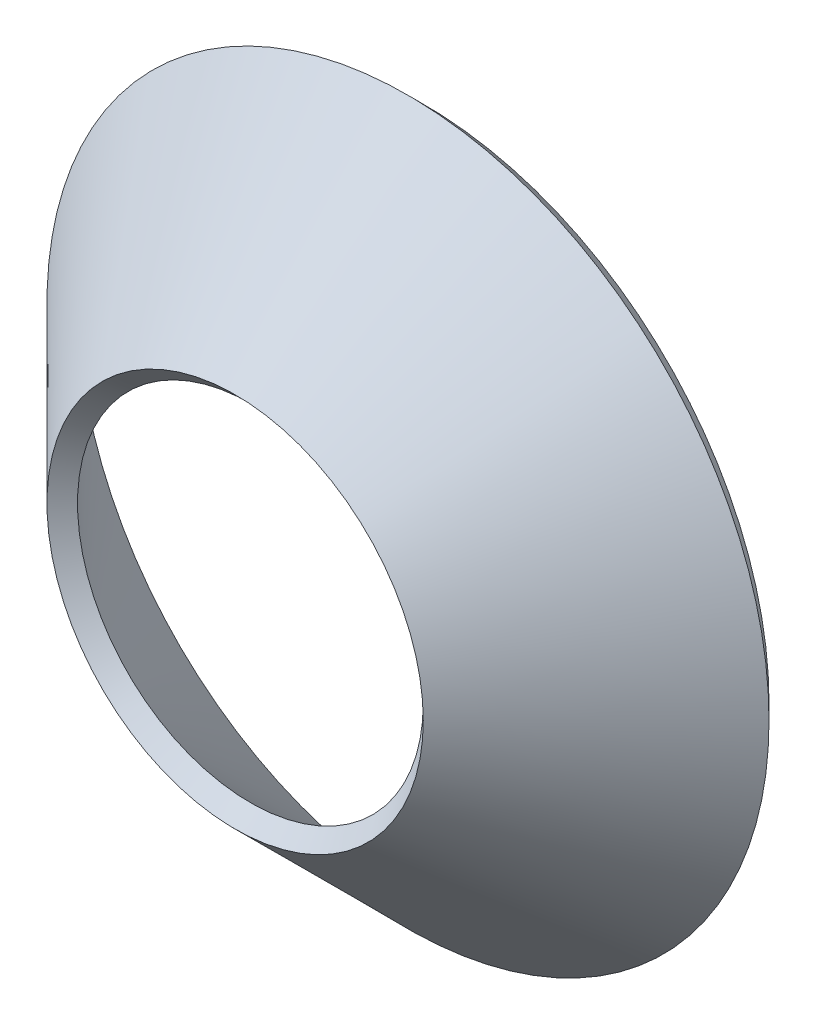
ISO-10303-21;
HEADER;
FILE_DESCRIPTION(('STEP AP214'),'2;1');
FILE_NAME('part.step','',(''),(''),'','','');
FILE_SCHEMA(('AUTOMOTIVE_DESIGN { 1 0 10303 214 1 1 1 1 }'));
ENDSEC;
DATA;
#1=APPLICATION_CONTEXT('core data for automotive mechanical design processes');
#2=APPLICATION_PROTOCOL_DEFINITION('international standard','automotive_design',2000,#1);
#3=PRODUCT_CONTEXT('',#1,'mechanical');
#4=PRODUCT('Part','Part','',(#3));
#5=PRODUCT_RELATED_PRODUCT_CATEGORY('part','',(#4));
#6=PRODUCT_DEFINITION_FORMATION('','',#4);
#7=PRODUCT_DEFINITION_CONTEXT('part definition',#1,'design');
#8=PRODUCT_DEFINITION('design','',#6,#7);
#9=PRODUCT_DEFINITION_SHAPE('','',#8);
#10=(LENGTH_UNIT() NAMED_UNIT(*) SI_UNIT(.MILLI.,.METRE.));
#11=(NAMED_UNIT(*) PLANE_ANGLE_UNIT() SI_UNIT($,.RADIAN.));
#12=(NAMED_UNIT(*) SI_UNIT($,.STERADIAN.) SOLID_ANGLE_UNIT());
#13=UNCERTAINTY_MEASURE_WITH_UNIT(LENGTH_MEASURE(1.E-05),#10,'distance_accuracy_value','');
#14=(GEOMETRIC_REPRESENTATION_CONTEXT(3) GLOBAL_UNCERTAINTY_ASSIGNED_CONTEXT((#13)) GLOBAL_UNIT_ASSIGNED_CONTEXT((#10,
#11,#12)) REPRESENTATION_CONTEXT('',''));
#15=CARTESIAN_POINT('',(0.,0.,0.));
#16=DIRECTION('',(0.,0.,1.));
#17=DIRECTION('',(1.,0.,0.));
#18=AXIS2_PLACEMENT_3D('',#15,#16,#17);
#19=CARTESIAN_POINT('',(0.,0.,25.4));
#20=DIRECTION('',(0.,0.,-1.));
#21=DIRECTION('',(-1.,0.,0.));
#22=AXIS2_PLACEMENT_3D('',#19,#20,#21);
#23=CONICAL_SURFACE('',#22,25.4,0.785398163397454);
#24=CARTESIAN_POINT('',(0.,0.,0.));
#25=DIRECTION('',(0.,0.,1.));
#26=DIRECTION('',(1.,0.,0.));
#27=AXIS2_PLACEMENT_3D('',#24,#25,#26);
#28=CIRCLE('',#27,50.8000000000003);
#29=CARTESIAN_POINT('',(50.8000000000003,0.,0.));
#30=VERTEX_POINT('',#29);
#31=EDGE_CURVE('E60',#30,#30,#28,.T.);
#32=ORIENTED_EDGE('',*,*,#31,.F.);
#33=EDGE_LOOP('',(#32));
#34=FACE_BOUND('',#33,.T.);
#35=CARTESIAN_POINT('',(0.,0.,25.4));
#36=DIRECTION('',(0.,0.,1.));
#37=DIRECTION('',(1.,0.,0.));
#38=AXIS2_PLACEMENT_3D('',#35,#36,#37);
#39=CIRCLE('',#38,25.4);
#40=CARTESIAN_POINT('',(25.4,0.,25.4));
#41=VERTEX_POINT('',#40);
#42=EDGE_CURVE('E10',#41,#41,#39,.T.);
#43=ORIENTED_EDGE('',*,*,#42,.T.);
#44=EDGE_LOOP('',(#43));
#45=FACE_BOUND('',#44,.T.);
#46=ADVANCED_FACE('F43',(#34,#45),#23,.F.);
#47=CARTESIAN_POINT('',(0.,0.,25.4));
#48=DIRECTION('',(0.,0.,1.));
#49=DIRECTION('',(1.,0.,0.));
#50=AXIS2_PLACEMENT_3D('',#47,#48,#49);
#51=CONICAL_SURFACE('',#50,25.4,0.785398163397443);
#52=CARTESIAN_POINT('',(0.,0.,27.6450640302673));
#53=DIRECTION('',(0.,0.,1.));
#54=DIRECTION('',(1.,0.,0.));
#55=AXIS2_PLACEMENT_3D('',#52,#53,#54);
#56=CIRCLE('',#55,27.6450640302673);
#57=CARTESIAN_POINT('',(27.6450640302673,0.,27.6450640302673));
#58=VERTEX_POINT('',#57);
#59=EDGE_CURVE('E50',#58,#58,#56,.T.);
#60=ORIENTED_EDGE('',*,*,#59,.T.);
#61=EDGE_LOOP('',(#60));
#62=FACE_BOUND('',#61,.T.);
#63=ORIENTED_EDGE('',*,*,#42,.F.);
#64=EDGE_LOOP('',(#63));
#65=FACE_BOUND('',#64,.T.);
#66=ADVANCED_FACE('F71',(#62,#65),#51,.F.);
#67=CARTESIAN_POINT('',(0.,0.,27.6450640302673));
#68=DIRECTION('',(0.,0.,-1.));
#69=DIRECTION('',(-1.,0.,0.));
#70=AXIS2_PLACEMENT_3D('',#67,#68,#69);
#71=CONICAL_SURFACE('',#70,27.6450640302673,0.785398163397454);
#72=CARTESIAN_POINT('',(0.,0.,2.2450640302673));
#73=DIRECTION('',(0.,0.,1.));
#74=DIRECTION('',(1.,0.,0.));
#75=AXIS2_PLACEMENT_3D('',#72,#73,#74);
#76=CIRCLE('',#75,53.0450640302675);
#77=CARTESIAN_POINT('',(53.0450640302675,0.,2.2450640302673));
#78=VERTEX_POINT('',#77);
#79=EDGE_CURVE('E55',#78,#78,#76,.T.);
#80=ORIENTED_EDGE('',*,*,#79,.T.);
#81=EDGE_LOOP('',(#80));
#82=FACE_BOUND('',#81,.T.);
#83=ORIENTED_EDGE('',*,*,#59,.F.);
#84=EDGE_LOOP('',(#83));
#85=FACE_BOUND('',#84,.T.);
#86=ADVANCED_FACE('F75',(#82,#85),#71,.T.);
#87=CARTESIAN_POINT('',(0.,0.,2.2450640302673));
#88=DIRECTION('',(0.,0.,1.));
#89=DIRECTION('',(1.,0.,0.));
#90=AXIS2_PLACEMENT_3D('',#87,#88,#89);
#91=CONICAL_SURFACE('',#90,53.0450640302675,0.785398163397442);
#92=ORIENTED_EDGE('',*,*,#31,.T.);
#93=EDGE_LOOP('',(#92));
#94=FACE_BOUND('',#93,.T.);
#95=ORIENTED_EDGE('',*,*,#79,.F.);
#96=EDGE_LOOP('',(#95));
#97=FACE_BOUND('',#96,.T.);
#98=ADVANCED_FACE('F67',(#94,#97),#91,.T.);
#99=CLOSED_SHELL('',(#46,#66,#86,#98));
#100=MANIFOLD_SOLID_BREP('B2',#99);
#101=ADVANCED_BREP_SHAPE_REPRESENTATION('',(#18,#100),#14);
#102=SHAPE_DEFINITION_REPRESENTATION(#9,#101);
ENDSEC;
END-ISO-10303-21;
